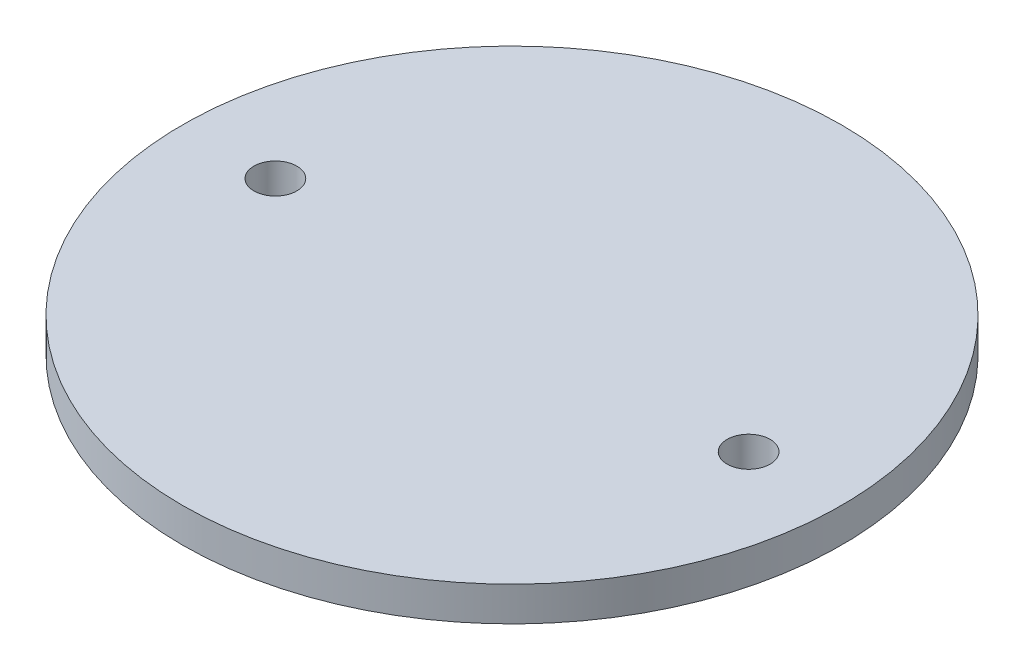
ISO-10303-21;
HEADER;
FILE_DESCRIPTION(('STEP AP214'),'2;1');
FILE_NAME('part.step','',(''),(''),'','','');
FILE_SCHEMA(('AUTOMOTIVE_DESIGN { 1 0 10303 214 1 1 1 1 }'));
ENDSEC;
DATA;
#1=APPLICATION_CONTEXT('core data for automotive mechanical design processes');
#2=APPLICATION_PROTOCOL_DEFINITION('international standard','automotive_design',2000,#1);
#3=PRODUCT_CONTEXT('',#1,'mechanical');
#4=PRODUCT('Part','Part','',(#3));
#5=PRODUCT_RELATED_PRODUCT_CATEGORY('part','',(#4));
#6=PRODUCT_DEFINITION_FORMATION('','',#4);
#7=PRODUCT_DEFINITION_CONTEXT('part definition',#1,'design');
#8=PRODUCT_DEFINITION('design','',#6,#7);
#9=PRODUCT_DEFINITION_SHAPE('','',#8);
#10=(LENGTH_UNIT() NAMED_UNIT(*) SI_UNIT(.MILLI.,.METRE.));
#11=(NAMED_UNIT(*) PLANE_ANGLE_UNIT() SI_UNIT($,.RADIAN.));
#12=(NAMED_UNIT(*) SI_UNIT($,.STERADIAN.) SOLID_ANGLE_UNIT());
#13=UNCERTAINTY_MEASURE_WITH_UNIT(LENGTH_MEASURE(1.E-05),#10,'distance_accuracy_value','');
#14=(GEOMETRIC_REPRESENTATION_CONTEXT(3) GLOBAL_UNCERTAINTY_ASSIGNED_CONTEXT((#13)) GLOBAL_UNIT_ASSIGNED_CONTEXT((#10,
#11,#12)) REPRESENTATION_CONTEXT('',''));
#15=CARTESIAN_POINT('',(0.,0.,0.));
#16=DIRECTION('',(0.,0.,1.));
#17=DIRECTION('',(1.,0.,0.));
#18=AXIS2_PLACEMENT_3D('',#15,#16,#17);
#19=CARTESIAN_POINT('',(0.,4.,0.));
#20=DIRECTION('',(0.,1.,0.));
#21=DIRECTION('',(0.,0.,1.));
#22=AXIS2_PLACEMENT_3D('',#19,#20,#21);
#23=PLANE('',#22);
#24=CARTESIAN_POINT('',(-27.5,4.,0.));
#25=DIRECTION('',(0.,1.,0.));
#26=DIRECTION('',(0.,0.,1.));
#27=AXIS2_PLACEMENT_3D('',#24,#25,#26);
#28=CIRCLE('',#27,2.5);
#29=CARTESIAN_POINT('',(-27.5,4.,2.5));
#30=VERTEX_POINT('',#29);
#31=EDGE_CURVE('E42',#30,#30,#28,.T.);
#32=ORIENTED_EDGE('',*,*,#31,.F.);
#33=EDGE_LOOP('',(#32));
#34=FACE_BOUND('',#33,.T.);
#35=CARTESIAN_POINT('',(0.,4.,0.));
#36=DIRECTION('',(0.,1.,0.));
#37=DIRECTION('',(0.,0.,1.));
#38=AXIS2_PLACEMENT_3D('',#35,#36,#37);
#39=CIRCLE('',#38,38.3);
#40=CARTESIAN_POINT('',(0.,4.,38.3));
#41=VERTEX_POINT('',#40);
#42=EDGE_CURVE('E10',#41,#41,#39,.T.);
#43=ORIENTED_EDGE('',*,*,#42,.T.);
#44=EDGE_LOOP('',(#43));
#45=FACE_BOUND('',#44,.T.);
#46=CARTESIAN_POINT('',(27.5,4.,0.));
#47=DIRECTION('',(0.,1.,0.));
#48=DIRECTION('',(0.,0.,1.));
#49=AXIS2_PLACEMENT_3D('',#46,#47,#48);
#50=CIRCLE('',#49,2.5);
#51=CARTESIAN_POINT('',(27.5,4.,2.49999999999999));
#52=VERTEX_POINT('',#51);
#53=EDGE_CURVE('E47',#52,#52,#50,.T.);
#54=ORIENTED_EDGE('',*,*,#53,.F.);
#55=EDGE_LOOP('',(#54));
#56=FACE_BOUND('',#55,.T.);
#57=ADVANCED_FACE('F31',(#34,#45,#56),#23,.T.);
#58=CARTESIAN_POINT('',(0.,0.,0.));
#59=DIRECTION('',(0.,1.,0.));
#60=DIRECTION('',(0.,0.,1.));
#61=AXIS2_PLACEMENT_3D('',#58,#59,#60);
#62=PLANE('',#61);
#63=CARTESIAN_POINT('',(0.,0.,0.));
#64=DIRECTION('',(0.,1.,0.));
#65=DIRECTION('',(0.,0.,1.));
#66=AXIS2_PLACEMENT_3D('',#63,#64,#65);
#67=CIRCLE('',#66,38.3);
#68=CARTESIAN_POINT('',(0.,0.,38.3));
#69=VERTEX_POINT('',#68);
#70=EDGE_CURVE('E35',#69,#69,#67,.T.);
#71=ORIENTED_EDGE('',*,*,#70,.F.);
#72=EDGE_LOOP('',(#71));
#73=FACE_BOUND('',#72,.T.);
#74=CARTESIAN_POINT('',(-27.5,0.,0.));
#75=DIRECTION('',(0.,1.,0.));
#76=DIRECTION('',(0.,0.,1.));
#77=AXIS2_PLACEMENT_3D('',#74,#75,#76);
#78=CIRCLE('',#77,2.5);
#79=CARTESIAN_POINT('',(-27.5,0.,2.5));
#80=VERTEX_POINT('',#79);
#81=EDGE_CURVE('E44',#80,#80,#78,.T.);
#82=ORIENTED_EDGE('',*,*,#81,.T.);
#83=EDGE_LOOP('',(#82));
#84=FACE_BOUND('',#83,.T.);
#85=CARTESIAN_POINT('',(27.5,0.,0.));
#86=DIRECTION('',(0.,1.,0.));
#87=DIRECTION('',(0.,0.,1.));
#88=AXIS2_PLACEMENT_3D('',#85,#86,#87);
#89=CIRCLE('',#88,2.5);
#90=CARTESIAN_POINT('',(27.5,0.,2.49999999999999));
#91=VERTEX_POINT('',#90);
#92=EDGE_CURVE('E50',#91,#91,#89,.T.);
#93=ORIENTED_EDGE('',*,*,#92,.T.);
#94=EDGE_LOOP('',(#93));
#95=FACE_BOUND('',#94,.T.);
#96=ADVANCED_FACE('F60',(#73,#84,#95),#62,.F.);
#97=CARTESIAN_POINT('',(0.,4.,0.));
#98=DIRECTION('',(0.,-1.,0.));
#99=DIRECTION('',(0.,0.,-1.));
#100=AXIS2_PLACEMENT_3D('',#97,#98,#99);
#101=CYLINDRICAL_SURFACE('',#100,38.3);
#102=ORIENTED_EDGE('',*,*,#42,.F.);
#103=EDGE_LOOP('',(#102));
#104=FACE_BOUND('',#103,.T.);
#105=ORIENTED_EDGE('',*,*,#70,.T.);
#106=EDGE_LOOP('',(#105));
#107=FACE_BOUND('',#106,.T.);
#108=ADVANCED_FACE('F33',(#104,#107),#101,.T.);
#109=CARTESIAN_POINT('',(-27.5,4.,0.));
#110=DIRECTION('',(0.,-1.,0.));
#111=DIRECTION('',(0.,0.,-1.));
#112=AXIS2_PLACEMENT_3D('',#109,#110,#111);
#113=CYLINDRICAL_SURFACE('',#112,2.5);
#114=ORIENTED_EDGE('',*,*,#31,.T.);
#115=EDGE_LOOP('',(#114));
#116=FACE_BOUND('',#115,.T.);
#117=ORIENTED_EDGE('',*,*,#81,.F.);
#118=EDGE_LOOP('',(#117));
#119=FACE_BOUND('',#118,.T.);
#120=ADVANCED_FACE('F69',(#116,#119),#113,.F.);
#121=CARTESIAN_POINT('',(27.5,4.,0.));
#122=DIRECTION('',(0.,-1.,0.));
#123=DIRECTION('',(0.,0.,-1.));
#124=AXIS2_PLACEMENT_3D('',#121,#122,#123);
#125=CYLINDRICAL_SURFACE('',#124,2.5);
#126=ORIENTED_EDGE('',*,*,#53,.T.);
#127=EDGE_LOOP('',(#126));
#128=FACE_BOUND('',#127,.T.);
#129=ORIENTED_EDGE('',*,*,#92,.F.);
#130=EDGE_LOOP('',(#129));
#131=FACE_BOUND('',#130,.T.);
#132=ADVANCED_FACE('F56',(#128,#131),#125,.F.);
#133=CLOSED_SHELL('',(#57,#96,#108,#120,#132));
#134=MANIFOLD_SOLID_BREP('B2',#133);
#135=ADVANCED_BREP_SHAPE_REPRESENTATION('',(#18,#134),#14);
#136=SHAPE_DEFINITION_REPRESENTATION(#9,#135);
ENDSEC;
END-ISO-10303-21;
